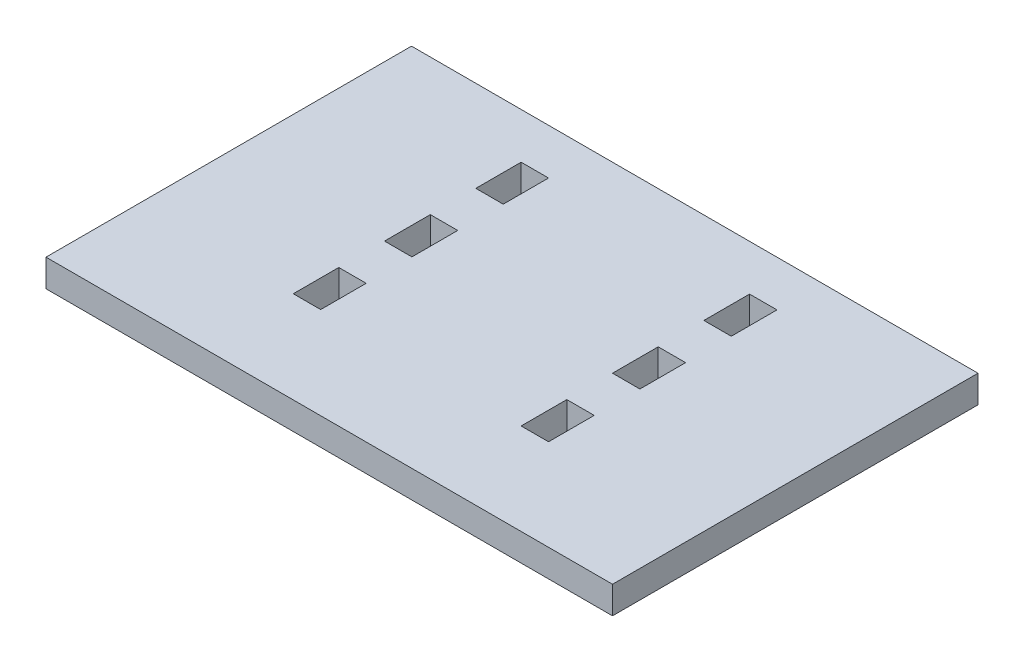
ISO-10303-21;
HEADER;
FILE_DESCRIPTION(('STEP AP214'),'2;1');
FILE_NAME('part.step','',(''),(''),'','','');
FILE_SCHEMA(('AUTOMOTIVE_DESIGN { 1 0 10303 214 1 1 1 1 }'));
ENDSEC;
DATA;
#1=APPLICATION_CONTEXT('core data for automotive mechanical design processes');
#2=APPLICATION_PROTOCOL_DEFINITION('international standard','automotive_design',2000,#1);
#3=PRODUCT_CONTEXT('',#1,'mechanical');
#4=PRODUCT('Part','Part','',(#3));
#5=PRODUCT_RELATED_PRODUCT_CATEGORY('part','',(#4));
#6=PRODUCT_DEFINITION_FORMATION('','',#4);
#7=PRODUCT_DEFINITION_CONTEXT('part definition',#1,'design');
#8=PRODUCT_DEFINITION('design','',#6,#7);
#9=PRODUCT_DEFINITION_SHAPE('','',#8);
#10=(LENGTH_UNIT() NAMED_UNIT(*) SI_UNIT(.MILLI.,.METRE.));
#11=(NAMED_UNIT(*) PLANE_ANGLE_UNIT() SI_UNIT($,.RADIAN.));
#12=(NAMED_UNIT(*) SI_UNIT($,.STERADIAN.) SOLID_ANGLE_UNIT());
#13=UNCERTAINTY_MEASURE_WITH_UNIT(LENGTH_MEASURE(1.E-05),#10,'distance_accuracy_value','');
#14=(GEOMETRIC_REPRESENTATION_CONTEXT(3) GLOBAL_UNCERTAINTY_ASSIGNED_CONTEXT((#13)) GLOBAL_UNIT_ASSIGNED_CONTEXT((#10,
#11,#12)) REPRESENTATION_CONTEXT('',''));
#15=CARTESIAN_POINT('',(0.,0.,0.));
#16=DIRECTION('',(0.,0.,1.));
#17=DIRECTION('',(1.,0.,0.));
#18=AXIS2_PLACEMENT_3D('',#15,#16,#17);
#19=CARTESIAN_POINT('',(0.,3.,0.));
#20=DIRECTION('',(0.,0.,-1.));
#21=DIRECTION('',(-1.,0.,0.));
#22=AXIS2_PLACEMENT_3D('',#19,#20,#21);
#23=PLANE('',#22);
#24=DIRECTION('',(1.,0.,0.));
#25=VECTOR('',#24,1.);
#26=CARTESIAN_POINT('',(0.,0.,0.));
#27=LINE('',#26,#25);
#28=CARTESIAN_POINT('',(-20.,0.,0.));
#29=VERTEX_POINT('',#28);
#30=CARTESIAN_POINT('',(42.,0.,0.));
#31=VERTEX_POINT('',#30);
#32=EDGE_CURVE('E342',#29,#31,#27,.T.);
#33=ORIENTED_EDGE('',*,*,#32,.T.);
#34=DIRECTION('',(0.,-1.,0.));
#35=VECTOR('',#34,1.);
#36=CARTESIAN_POINT('',(42.,3.,0.));
#37=LINE('',#36,#35);
#38=CARTESIAN_POINT('',(42.,3.,0.));
#39=VERTEX_POINT('',#38);
#40=EDGE_CURVE('E11',#39,#31,#37,.T.);
#41=ORIENTED_EDGE('',*,*,#40,.F.);
#42=DIRECTION('',(1.,0.,0.));
#43=VECTOR('',#42,1.);
#44=CARTESIAN_POINT('',(0.,3.,0.));
#45=LINE('',#44,#43);
#46=CARTESIAN_POINT('',(-20.,3.,0.));
#47=VERTEX_POINT('',#46);
#48=EDGE_CURVE('E248',#47,#39,#45,.T.);
#49=ORIENTED_EDGE('',*,*,#48,.F.);
#50=DIRECTION('',(0.,-1.,0.));
#51=VECTOR('',#50,1.);
#52=CARTESIAN_POINT('',(-20.,3.,0.));
#53=LINE('',#52,#51);
#54=EDGE_CURVE('E354',#47,#29,#53,.T.);
#55=ORIENTED_EDGE('',*,*,#54,.T.);
#56=EDGE_LOOP('',(#33,#41,#49,#55));
#57=FACE_BOUND('',#56,.T.);
#58=ADVANCED_FACE('F41',(#57),#23,.F.);
#59=CARTESIAN_POINT('',(42.,3.,0.));
#60=DIRECTION('',(1.,0.,0.));
#61=DIRECTION('',(0.,0.,-1.));
#62=AXIS2_PLACEMENT_3D('',#59,#60,#61);
#63=PLANE('',#62);
#64=DIRECTION('',(0.,0.,1.));
#65=VECTOR('',#64,1.);
#66=CARTESIAN_POINT('',(42.,0.,0.));
#67=LINE('',#66,#65);
#68=CARTESIAN_POINT('',(42.,0.,-40.));
#69=VERTEX_POINT('',#68);
#70=EDGE_CURVE('E238',#69,#31,#67,.T.);
#71=ORIENTED_EDGE('',*,*,#70,.F.);
#72=DIRECTION('',(0.,-1.,0.));
#73=VECTOR('',#72,1.);
#74=CARTESIAN_POINT('',(42.,3.,-40.));
#75=LINE('',#74,#73);
#76=CARTESIAN_POINT('',(42.,3.,-40.));
#77=VERTEX_POINT('',#76);
#78=EDGE_CURVE('E52',#77,#69,#75,.T.);
#79=ORIENTED_EDGE('',*,*,#78,.F.);
#80=DIRECTION('',(0.,0.,1.));
#81=VECTOR('',#80,1.);
#82=CARTESIAN_POINT('',(42.,3.,0.));
#83=LINE('',#82,#81);
#84=EDGE_CURVE('E236',#77,#39,#83,.T.);
#85=ORIENTED_EDGE('',*,*,#84,.T.);
#86=ORIENTED_EDGE('',*,*,#40,.T.);
#87=EDGE_LOOP('',(#71,#79,#85,#86));
#88=FACE_BOUND('',#87,.T.);
#89=ADVANCED_FACE('F235',(#88),#63,.T.);
#90=CARTESIAN_POINT('',(0.,3.,-40.));
#91=DIRECTION('',(0.,0.,-1.));
#92=DIRECTION('',(-1.,0.,0.));
#93=AXIS2_PLACEMENT_3D('',#90,#91,#92);
#94=PLANE('',#93);
#95=DIRECTION('',(1.,0.,0.));
#96=VECTOR('',#95,1.);
#97=CARTESIAN_POINT('',(0.,0.,-40.));
#98=LINE('',#97,#96);
#99=CARTESIAN_POINT('',(-20.,0.,-40.));
#100=VERTEX_POINT('',#99);
#101=EDGE_CURVE('E348',#100,#69,#98,.T.);
#102=ORIENTED_EDGE('',*,*,#101,.F.);
#103=DIRECTION('',(0.,-1.,0.));
#104=VECTOR('',#103,1.);
#105=CARTESIAN_POINT('',(-20.,3.,-40.));
#106=LINE('',#105,#104);
#107=CARTESIAN_POINT('',(-20.,3.,-40.));
#108=VERTEX_POINT('',#107);
#109=EDGE_CURVE('E148',#108,#100,#106,.T.);
#110=ORIENTED_EDGE('',*,*,#109,.F.);
#111=DIRECTION('',(1.,0.,0.));
#112=VECTOR('',#111,1.);
#113=CARTESIAN_POINT('',(0.,3.,-40.));
#114=LINE('',#113,#112);
#115=EDGE_CURVE('E246',#108,#77,#114,.T.);
#116=ORIENTED_EDGE('',*,*,#115,.T.);
#117=ORIENTED_EDGE('',*,*,#78,.T.);
#118=EDGE_LOOP('',(#102,#110,#116,#117));
#119=FACE_BOUND('',#118,.T.);
#120=ADVANCED_FACE('F252',(#119),#94,.T.);
#121=CARTESIAN_POINT('',(0.,3.,0.));
#122=DIRECTION('',(-1.,0.,0.));
#123=DIRECTION('',(0.,0.,1.));
#124=AXIS2_PLACEMENT_3D('',#121,#122,#123);
#125=PLANE('',#124);
#126=DIRECTION('',(0.,0.,-1.));
#127=VECTOR('',#126,1.);
#128=CARTESIAN_POINT('',(0.,0.,0.));
#129=LINE('',#128,#127);
#130=CARTESIAN_POINT('',(0.,0.,-30.0396951821505));
#131=VERTEX_POINT('',#130);
#132=CARTESIAN_POINT('',(0.,0.,-35.));
#133=VERTEX_POINT('',#132);
#134=EDGE_CURVE('E305',#131,#133,#129,.T.);
#135=ORIENTED_EDGE('',*,*,#134,.F.);
#136=DIRECTION('',(0.,-1.,0.));
#137=VECTOR('',#136,1.);
#138=CARTESIAN_POINT('',(0.,3.,-30.0396951821505));
#139=LINE('',#138,#137);
#140=CARTESIAN_POINT('',(0.,3.,-30.0396951821505));
#141=VERTEX_POINT('',#140);
#142=EDGE_CURVE('E357',#141,#131,#139,.T.);
#143=ORIENTED_EDGE('',*,*,#142,.F.);
#144=DIRECTION('',(0.,0.,-1.));
#145=VECTOR('',#144,1.);
#146=CARTESIAN_POINT('',(0.,3.,0.));
#147=LINE('',#146,#145);
#148=CARTESIAN_POINT('',(0.,3.,-35.));
#149=VERTEX_POINT('',#148);
#150=EDGE_CURVE('E491',#141,#149,#147,.T.);
#151=ORIENTED_EDGE('',*,*,#150,.T.);
#152=DIRECTION('',(0.,-1.,0.));
#153=VECTOR('',#152,1.);
#154=CARTESIAN_POINT('',(0.,3.,-35.));
#155=LINE('',#154,#153);
#156=EDGE_CURVE('E360',#149,#133,#155,.T.);
#157=ORIENTED_EDGE('',*,*,#156,.T.);
#158=EDGE_LOOP('',(#135,#143,#151,#157));
#159=FACE_BOUND('',#158,.T.);
#160=ADVANCED_FACE('F588',(#159),#125,.T.);
#161=CARTESIAN_POINT('',(0.,3.,-30.0396951821505));
#162=DIRECTION('',(0.,0.,1.));
#163=DIRECTION('',(1.,0.,0.));
#164=AXIS2_PLACEMENT_3D('',#161,#162,#163);
#165=PLANE('',#164);
#166=DIRECTION('',(-1.,0.,0.));
#167=VECTOR('',#166,1.);
#168=CARTESIAN_POINT('',(0.,0.,-30.0396951821505));
#169=LINE('',#168,#167);
#170=CARTESIAN_POINT('',(-3.,0.,-30.0396951821505));
#171=VERTEX_POINT('',#170);
#172=EDGE_CURVE('E330',#131,#171,#169,.T.);
#173=ORIENTED_EDGE('',*,*,#172,.T.);
#174=DIRECTION('',(0.,-1.,0.));
#175=VECTOR('',#174,1.);
#176=CARTESIAN_POINT('',(-3.,3.,-30.0396951821505));
#177=LINE('',#176,#175);
#178=CARTESIAN_POINT('',(-3.,3.,-30.0396951821505));
#179=VERTEX_POINT('',#178);
#180=EDGE_CURVE('E367',#179,#171,#177,.T.);
#181=ORIENTED_EDGE('',*,*,#180,.F.);
#182=DIRECTION('',(-1.,0.,0.));
#183=VECTOR('',#182,1.);
#184=CARTESIAN_POINT('',(0.,3.,-30.0396951821505));
#185=LINE('',#184,#183);
#186=EDGE_CURVE('E514',#141,#179,#185,.T.);
#187=ORIENTED_EDGE('',*,*,#186,.F.);
#188=ORIENTED_EDGE('',*,*,#142,.T.);
#189=EDGE_LOOP('',(#173,#181,#187,#188));
#190=FACE_BOUND('',#189,.T.);
#191=ADVANCED_FACE('F592',(#190),#165,.F.);
#192=CARTESIAN_POINT('',(-3.,3.,0.));
#193=DIRECTION('',(1.,0.,0.));
#194=DIRECTION('',(0.,0.,-1.));
#195=AXIS2_PLACEMENT_3D('',#192,#193,#194);
#196=PLANE('',#195);
#197=DIRECTION('',(0.,0.,1.));
#198=VECTOR('',#197,1.);
#199=CARTESIAN_POINT('',(-3.,0.,0.));
#200=LINE('',#199,#198);
#201=CARTESIAN_POINT('',(-3.,0.,-35.));
#202=VERTEX_POINT('',#201);
#203=EDGE_CURVE('E334',#202,#171,#200,.T.);
#204=ORIENTED_EDGE('',*,*,#203,.F.);
#205=DIRECTION('',(0.,-1.,0.));
#206=VECTOR('',#205,1.);
#207=CARTESIAN_POINT('',(-3.,3.,-35.));
#208=LINE('',#207,#206);
#209=CARTESIAN_POINT('',(-3.,3.,-35.));
#210=VERTEX_POINT('',#209);
#211=EDGE_CURVE('E363',#210,#202,#208,.T.);
#212=ORIENTED_EDGE('',*,*,#211,.F.);
#213=DIRECTION('',(0.,0.,1.));
#214=VECTOR('',#213,1.);
#215=CARTESIAN_POINT('',(-3.,3.,0.));
#216=LINE('',#215,#214);
#217=EDGE_CURVE('E517',#210,#179,#216,.T.);
#218=ORIENTED_EDGE('',*,*,#217,.T.);
#219=ORIENTED_EDGE('',*,*,#180,.T.);
#220=EDGE_LOOP('',(#204,#212,#218,#219));
#221=FACE_BOUND('',#220,.T.);
#222=ADVANCED_FACE('F595',(#221),#196,.T.);
#223=CARTESIAN_POINT('',(0.,0.,-20.0456534086488));
#224=VERTEX_POINT('',#223);
#225=CARTESIAN_POINT('',(0.,0.,-25.0601748364164));
#226=VERTEX_POINT('',#225);
#227=EDGE_CURVE('E306',#224,#226,#129,.T.);
#228=ORIENTED_EDGE('',*,*,#227,.F.);
#229=DIRECTION('',(0.,-1.,0.));
#230=VECTOR('',#229,1.);
#231=CARTESIAN_POINT('',(0.,3.,-20.0456534086488));
#232=LINE('',#231,#230);
#233=CARTESIAN_POINT('',(0.,3.,-20.0456534086488));
#234=VERTEX_POINT('',#233);
#235=EDGE_CURVE('E364',#234,#224,#232,.T.);
#236=ORIENTED_EDGE('',*,*,#235,.F.);
#237=CARTESIAN_POINT('',(0.,3.,-25.0601748364164));
#238=VERTEX_POINT('',#237);
#239=EDGE_CURVE('E492',#234,#238,#147,.T.);
#240=ORIENTED_EDGE('',*,*,#239,.T.);
#241=DIRECTION('',(0.,-1.,0.));
#242=VECTOR('',#241,1.);
#243=CARTESIAN_POINT('',(0.,3.,-25.0601748364164));
#244=LINE('',#243,#242);
#245=EDGE_CURVE('E372',#238,#226,#244,.T.);
#246=ORIENTED_EDGE('',*,*,#245,.T.);
#247=EDGE_LOOP('',(#228,#236,#240,#246));
#248=FACE_BOUND('',#247,.T.);
#249=ADVANCED_FACE('F619',(#248),#125,.T.);
#250=CARTESIAN_POINT('',(0.,3.,-20.0456534086488));
#251=DIRECTION('',(0.,0.,1.));
#252=DIRECTION('',(1.,0.,0.));
#253=AXIS2_PLACEMENT_3D('',#250,#251,#252);
#254=PLANE('',#253);
#255=DIRECTION('',(-1.,0.,0.));
#256=VECTOR('',#255,1.);
#257=CARTESIAN_POINT('',(0.,0.,-20.0456534086488));
#258=LINE('',#257,#256);
#259=CARTESIAN_POINT('',(-3.,0.,-20.0456534086488));
#260=VERTEX_POINT('',#259);
#261=EDGE_CURVE('E318',#224,#260,#258,.T.);
#262=ORIENTED_EDGE('',*,*,#261,.T.);
#263=DIRECTION('',(0.,-1.,0.));
#264=VECTOR('',#263,1.);
#265=CARTESIAN_POINT('',(-3.,3.,-20.0456534086488));
#266=LINE('',#265,#264);
#267=CARTESIAN_POINT('',(-3.,3.,-20.0456534086488));
#268=VERTEX_POINT('',#267);
#269=EDGE_CURVE('E379',#268,#260,#266,.T.);
#270=ORIENTED_EDGE('',*,*,#269,.F.);
#271=DIRECTION('',(-1.,0.,0.));
#272=VECTOR('',#271,1.);
#273=CARTESIAN_POINT('',(0.,3.,-20.0456534086488));
#274=LINE('',#273,#272);
#275=EDGE_CURVE('E503',#234,#268,#274,.T.);
#276=ORIENTED_EDGE('',*,*,#275,.F.);
#277=ORIENTED_EDGE('',*,*,#235,.T.);
#278=EDGE_LOOP('',(#262,#270,#276,#277));
#279=FACE_BOUND('',#278,.T.);
#280=ADVANCED_FACE('F618',(#279),#254,.F.);
#281=CARTESIAN_POINT('',(-3.,3.,0.));
#282=DIRECTION('',(1.,0.,0.));
#283=DIRECTION('',(0.,0.,-1.));
#284=AXIS2_PLACEMENT_3D('',#281,#282,#283);
#285=PLANE('',#284);
#286=DIRECTION('',(0.,0.,1.));
#287=VECTOR('',#286,1.);
#288=CARTESIAN_POINT('',(-3.,0.,0.));
#289=LINE('',#288,#287);
#290=CARTESIAN_POINT('',(-3.,0.,-25.0601748364164));
#291=VERTEX_POINT('',#290);
#292=EDGE_CURVE('E322',#291,#260,#289,.T.);
#293=ORIENTED_EDGE('',*,*,#292,.F.);
#294=DIRECTION('',(0.,-1.,0.));
#295=VECTOR('',#294,1.);
#296=CARTESIAN_POINT('',(-3.,3.,-25.0601748364164));
#297=LINE('',#296,#295);
#298=CARTESIAN_POINT('',(-3.,3.,-25.0601748364164));
#299=VERTEX_POINT('',#298);
#300=EDGE_CURVE('E375',#299,#291,#297,.T.);
#301=ORIENTED_EDGE('',*,*,#300,.F.);
#302=DIRECTION('',(0.,0.,1.));
#303=VECTOR('',#302,1.);
#304=CARTESIAN_POINT('',(-3.,3.,0.));
#305=LINE('',#304,#303);
#306=EDGE_CURVE('E506',#299,#268,#305,.T.);
#307=ORIENTED_EDGE('',*,*,#306,.T.);
#308=ORIENTED_EDGE('',*,*,#269,.T.);
#309=EDGE_LOOP('',(#293,#301,#307,#308));
#310=FACE_BOUND('',#309,.T.);
#311=ADVANCED_FACE('F614',(#310),#285,.T.);
#312=CARTESIAN_POINT('',(0.,0.,-10.0627705245664));
#313=VERTEX_POINT('',#312);
#314=CARTESIAN_POINT('',(0.,0.,-15.0419221686592));
#315=VERTEX_POINT('',#314);
#316=EDGE_CURVE('E300',#313,#315,#129,.T.);
#317=ORIENTED_EDGE('',*,*,#316,.F.);
#318=DIRECTION('',(0.,-1.,0.));
#319=VECTOR('',#318,1.);
#320=CARTESIAN_POINT('',(0.,3.,-10.0627705245664));
#321=LINE('',#320,#319);
#322=CARTESIAN_POINT('',(0.,3.,-10.0627705245664));
#323=VERTEX_POINT('',#322);
#324=EDGE_CURVE('E376',#323,#313,#321,.T.);
#325=ORIENTED_EDGE('',*,*,#324,.F.);
#326=CARTESIAN_POINT('',(0.,3.,-15.0419221686592));
#327=VERTEX_POINT('',#326);
#328=EDGE_CURVE('E486',#323,#327,#147,.T.);
#329=ORIENTED_EDGE('',*,*,#328,.T.);
#330=DIRECTION('',(0.,-1.,0.));
#331=VECTOR('',#330,1.);
#332=CARTESIAN_POINT('',(0.,3.,-15.0419221686592));
#333=LINE('',#332,#331);
#334=EDGE_CURVE('E384',#327,#315,#333,.T.);
#335=ORIENTED_EDGE('',*,*,#334,.T.);
#336=EDGE_LOOP('',(#317,#325,#329,#335));
#337=FACE_BOUND('',#336,.T.);
#338=ADVANCED_FACE('F622',(#337),#125,.T.);
#339=CARTESIAN_POINT('',(0.,3.,-10.0627705245664));
#340=DIRECTION('',(0.,0.,1.));
#341=DIRECTION('',(1.,0.,0.));
#342=AXIS2_PLACEMENT_3D('',#339,#340,#341);
#343=PLANE('',#342);
#344=DIRECTION('',(-1.,0.,0.));
#345=VECTOR('',#344,1.);
#346=CARTESIAN_POINT('',(0.,0.,-10.0627705245664));
#347=LINE('',#346,#345);
#348=CARTESIAN_POINT('',(-3.,0.,-10.0627705245664));
#349=VERTEX_POINT('',#348);
#350=EDGE_CURVE('E304',#313,#349,#347,.T.);
#351=ORIENTED_EDGE('',*,*,#350,.T.);
#352=DIRECTION('',(0.,-1.,0.));
#353=VECTOR('',#352,1.);
#354=CARTESIAN_POINT('',(-3.,3.,-10.0627705245664));
#355=LINE('',#354,#353);
#356=CARTESIAN_POINT('',(-3.,3.,-10.0627705245664));
#357=VERTEX_POINT('',#356);
#358=EDGE_CURVE('E391',#357,#349,#355,.T.);
#359=ORIENTED_EDGE('',*,*,#358,.F.);
#360=DIRECTION('',(-1.,0.,0.));
#361=VECTOR('',#360,1.);
#362=CARTESIAN_POINT('',(0.,3.,-10.0627705245664));
#363=LINE('',#362,#361);
#364=EDGE_CURVE('E490',#323,#357,#363,.T.);
#365=ORIENTED_EDGE('',*,*,#364,.F.);
#366=ORIENTED_EDGE('',*,*,#324,.T.);
#367=EDGE_LOOP('',(#351,#359,#365,#366));
#368=FACE_BOUND('',#367,.T.);
#369=ADVANCED_FACE('F633',(#368),#343,.F.);
#370=CARTESIAN_POINT('',(-3.,3.,0.));
#371=DIRECTION('',(1.,0.,0.));
#372=DIRECTION('',(0.,0.,-1.));
#373=AXIS2_PLACEMENT_3D('',#370,#371,#372);
#374=PLANE('',#373);
#375=DIRECTION('',(0.,0.,1.));
#376=VECTOR('',#375,1.);
#377=CARTESIAN_POINT('',(-3.,0.,0.));
#378=LINE('',#377,#376);
#379=CARTESIAN_POINT('',(-3.,0.,-15.0419221686592));
#380=VERTEX_POINT('',#379);
#381=EDGE_CURVE('E310',#380,#349,#378,.T.);
#382=ORIENTED_EDGE('',*,*,#381,.F.);
#383=DIRECTION('',(0.,-1.,0.));
#384=VECTOR('',#383,1.);
#385=CARTESIAN_POINT('',(-3.,3.,-15.0419221686592));
#386=LINE('',#385,#384);
#387=CARTESIAN_POINT('',(-3.,3.,-15.0419221686592));
#388=VERTEX_POINT('',#387);
#389=EDGE_CURVE('E387',#388,#380,#386,.T.);
#390=ORIENTED_EDGE('',*,*,#389,.F.);
#391=DIRECTION('',(0.,0.,1.));
#392=VECTOR('',#391,1.);
#393=CARTESIAN_POINT('',(-3.,3.,0.));
#394=LINE('',#393,#392);
#395=EDGE_CURVE('E495',#388,#357,#394,.T.);
#396=ORIENTED_EDGE('',*,*,#395,.T.);
#397=ORIENTED_EDGE('',*,*,#358,.T.);
#398=EDGE_LOOP('',(#382,#390,#396,#397));
#399=FACE_BOUND('',#398,.T.);
#400=ADVANCED_FACE('F692',(#399),#374,.T.);
#401=CARTESIAN_POINT('',(0.,3.,-30.));
#402=DIRECTION('',(0.,0.,-1.));
#403=DIRECTION('',(-1.,0.,0.));
#404=AXIS2_PLACEMENT_3D('',#401,#402,#403);
#405=PLANE('',#404);
#406=DIRECTION('',(1.,0.,0.));
#407=VECTOR('',#406,1.);
#408=CARTESIAN_POINT('',(0.,0.,-30.));
#409=LINE('',#408,#407);
#410=CARTESIAN_POINT('',(22.,0.,-30.));
#411=VERTEX_POINT('',#410);
#412=CARTESIAN_POINT('',(24.9981122641106,0.,-30.));
#413=VERTEX_POINT('',#412);
#414=EDGE_CURVE('E288',#411,#413,#409,.T.);
#415=ORIENTED_EDGE('',*,*,#414,.F.);
#416=DIRECTION('',(0.,-1.,0.));
#417=VECTOR('',#416,1.);
#418=CARTESIAN_POINT('',(22.,3.,-30.));
#419=LINE('',#418,#417);
#420=CARTESIAN_POINT('',(22.,3.,-30.));
#421=VERTEX_POINT('',#420);
#422=EDGE_CURVE('E388',#421,#411,#419,.T.);
#423=ORIENTED_EDGE('',*,*,#422,.F.);
#424=DIRECTION('',(1.,0.,0.));
#425=VECTOR('',#424,1.);
#426=CARTESIAN_POINT('',(0.,3.,-30.));
#427=LINE('',#426,#425);
#428=CARTESIAN_POINT('',(24.9981122641106,3.,-30.));
#429=VERTEX_POINT('',#428);
#430=EDGE_CURVE('E475',#421,#429,#427,.T.);
#431=ORIENTED_EDGE('',*,*,#430,.T.);
#432=DIRECTION('',(0.,-1.,0.));
#433=VECTOR('',#432,1.);
#434=CARTESIAN_POINT('',(24.9981122641106,3.,-30.));
#435=LINE('',#434,#433);
#436=EDGE_CURVE('E396',#429,#413,#435,.T.);
#437=ORIENTED_EDGE('',*,*,#436,.T.);
#438=EDGE_LOOP('',(#415,#423,#431,#437));
#439=FACE_BOUND('',#438,.T.);
#440=ADVANCED_FACE('F563',(#439),#405,.T.);
#441=CARTESIAN_POINT('',(22.,3.,0.));
#442=DIRECTION('',(-1.,0.,0.));
#443=DIRECTION('',(0.,0.,1.));
#444=AXIS2_PLACEMENT_3D('',#441,#442,#443);
#445=PLANE('',#444);
#446=DIRECTION('',(0.,0.,-1.));
#447=VECTOR('',#446,1.);
#448=CARTESIAN_POINT('',(22.,0.,0.));
#449=LINE('',#448,#447);
#450=CARTESIAN_POINT('',(22.,0.,-35.));
#451=VERTEX_POINT('',#450);
#452=EDGE_CURVE('E268',#411,#451,#449,.T.);
#453=ORIENTED_EDGE('',*,*,#452,.T.);
#454=DIRECTION('',(0.,-1.,0.));
#455=VECTOR('',#454,1.);
#456=CARTESIAN_POINT('',(22.,3.,-35.));
#457=LINE('',#456,#455);
#458=CARTESIAN_POINT('',(22.,3.,-35.));
#459=VERTEX_POINT('',#458);
#460=EDGE_CURVE('E404',#459,#451,#457,.T.);
#461=ORIENTED_EDGE('',*,*,#460,.F.);
#462=DIRECTION('',(0.,0.,-1.));
#463=VECTOR('',#462,1.);
#464=CARTESIAN_POINT('',(22.,3.,0.));
#465=LINE('',#464,#463);
#466=EDGE_CURVE('E461',#421,#459,#465,.T.);
#467=ORIENTED_EDGE('',*,*,#466,.F.);
#468=ORIENTED_EDGE('',*,*,#422,.T.);
#469=EDGE_LOOP('',(#453,#461,#467,#468));
#470=FACE_BOUND('',#469,.T.);
#471=ADVANCED_FACE('F558',(#470),#445,.F.);
#472=CARTESIAN_POINT('',(0.,3.,-35.));
#473=DIRECTION('',(0.,0.,-1.));
#474=DIRECTION('',(-1.,0.,0.));
#475=AXIS2_PLACEMENT_3D('',#472,#473,#474);
#476=PLANE('',#475);
#477=DIRECTION('',(1.,0.,0.));
#478=VECTOR('',#477,1.);
#479=CARTESIAN_POINT('',(0.,0.,-35.));
#480=LINE('',#479,#478);
#481=CARTESIAN_POINT('',(24.9981122641106,0.,-35.));
#482=VERTEX_POINT('',#481);
#483=EDGE_CURVE('E292',#451,#482,#480,.T.);
#484=ORIENTED_EDGE('',*,*,#483,.T.);
#485=DIRECTION('',(0.,-1.,0.));
#486=VECTOR('',#485,1.);
#487=CARTESIAN_POINT('',(24.9981122641106,3.,-35.));
#488=LINE('',#487,#486);
#489=CARTESIAN_POINT('',(24.9981122641106,3.,-35.));
#490=VERTEX_POINT('',#489);
#491=EDGE_CURVE('E399',#490,#482,#488,.T.);
#492=ORIENTED_EDGE('',*,*,#491,.F.);
#493=DIRECTION('',(1.,0.,0.));
#494=VECTOR('',#493,1.);
#495=CARTESIAN_POINT('',(0.,3.,-35.));
#496=LINE('',#495,#494);
#497=EDGE_CURVE('E479',#459,#490,#496,.T.);
#498=ORIENTED_EDGE('',*,*,#497,.F.);
#499=ORIENTED_EDGE('',*,*,#460,.T.);
#500=EDGE_LOOP('',(#484,#492,#498,#499));
#501=FACE_BOUND('',#500,.T.);
#502=ADVANCED_FACE('F570',(#501),#476,.F.);
#503=CARTESIAN_POINT('',(0.,3.,-20.));
#504=DIRECTION('',(0.,0.,-1.));
#505=DIRECTION('',(-1.,0.,0.));
#506=AXIS2_PLACEMENT_3D('',#503,#504,#505);
#507=PLANE('',#506);
#508=DIRECTION('',(1.,0.,0.));
#509=VECTOR('',#508,1.);
#510=CARTESIAN_POINT('',(0.,0.,-20.));
#511=LINE('',#510,#509);
#512=CARTESIAN_POINT('',(22.,0.,-20.));
#513=VERTEX_POINT('',#512);
#514=CARTESIAN_POINT('',(24.9981122641106,0.,-20.));
#515=VERTEX_POINT('',#514);
#516=EDGE_CURVE('E276',#513,#515,#511,.T.);
#517=ORIENTED_EDGE('',*,*,#516,.F.);
#518=DIRECTION('',(0.,-1.,0.));
#519=VECTOR('',#518,1.);
#520=CARTESIAN_POINT('',(22.,3.,-20.));
#521=LINE('',#520,#519);
#522=CARTESIAN_POINT('',(22.,3.,-20.));
#523=VERTEX_POINT('',#522);
#524=EDGE_CURVE('E400',#523,#513,#521,.T.);
#525=ORIENTED_EDGE('',*,*,#524,.F.);
#526=DIRECTION('',(1.,0.,0.));
#527=VECTOR('',#526,1.);
#528=CARTESIAN_POINT('',(0.,3.,-20.));
#529=LINE('',#528,#527);
#530=CARTESIAN_POINT('',(24.9981122641106,3.,-20.));
#531=VERTEX_POINT('',#530);
#532=EDGE_CURVE('E458',#523,#531,#529,.T.);
#533=ORIENTED_EDGE('',*,*,#532,.T.);
#534=DIRECTION('',(0.,-1.,0.));
#535=VECTOR('',#534,1.);
#536=CARTESIAN_POINT('',(24.9981122641106,3.,-20.));
#537=LINE('',#536,#535);
#538=EDGE_CURVE('E410',#531,#515,#537,.T.);
#539=ORIENTED_EDGE('',*,*,#538,.T.);
#540=EDGE_LOOP('',(#517,#525,#533,#539));
#541=FACE_BOUND('',#540,.T.);
#542=ADVANCED_FACE('F550',(#541),#507,.T.);
#543=CARTESIAN_POINT('',(22.,0.,-25.));
#544=VERTEX_POINT('',#543);
#545=EDGE_CURVE('E269',#513,#544,#449,.T.);
#546=ORIENTED_EDGE('',*,*,#545,.T.);
#547=DIRECTION('',(0.,-1.,0.));
#548=VECTOR('',#547,1.);
#549=CARTESIAN_POINT('',(22.,3.,-25.));
#550=LINE('',#549,#548);
#551=CARTESIAN_POINT('',(22.,3.,-25.));
#552=VERTEX_POINT('',#551);
#553=EDGE_CURVE('E417',#552,#544,#550,.T.);
#554=ORIENTED_EDGE('',*,*,#553,.F.);
#555=EDGE_CURVE('E462',#523,#552,#465,.T.);
#556=ORIENTED_EDGE('',*,*,#555,.F.);
#557=ORIENTED_EDGE('',*,*,#524,.T.);
#558=EDGE_LOOP('',(#546,#554,#556,#557));
#559=FACE_BOUND('',#558,.T.);
#560=ADVANCED_FACE('F541',(#559),#445,.F.);
#561=CARTESIAN_POINT('',(0.,3.,-25.));
#562=DIRECTION('',(0.,0.,-1.));
#563=DIRECTION('',(-1.,0.,0.));
#564=AXIS2_PLACEMENT_3D('',#561,#562,#563);
#565=PLANE('',#564);
#566=DIRECTION('',(1.,0.,0.));
#567=VECTOR('',#566,1.);
#568=CARTESIAN_POINT('',(0.,0.,-25.));
#569=LINE('',#568,#567);
#570=CARTESIAN_POINT('',(24.9981122641106,0.,-25.));
#571=VERTEX_POINT('',#570);
#572=EDGE_CURVE('E280',#544,#571,#569,.T.);
#573=ORIENTED_EDGE('',*,*,#572,.T.);
#574=DIRECTION('',(0.,-1.,0.));
#575=VECTOR('',#574,1.);
#576=CARTESIAN_POINT('',(24.9981122641106,3.,-25.));
#577=LINE('',#576,#575);
#578=CARTESIAN_POINT('',(24.9981122641106,3.,-25.));
#579=VERTEX_POINT('',#578);
#580=EDGE_CURVE('E413',#579,#571,#577,.T.);
#581=ORIENTED_EDGE('',*,*,#580,.F.);
#582=DIRECTION('',(1.,0.,0.));
#583=VECTOR('',#582,1.);
#584=CARTESIAN_POINT('',(0.,3.,-25.));
#585=LINE('',#584,#583);
#586=EDGE_CURVE('E468',#552,#579,#585,.T.);
#587=ORIENTED_EDGE('',*,*,#586,.F.);
#588=ORIENTED_EDGE('',*,*,#553,.T.);
#589=EDGE_LOOP('',(#573,#581,#587,#588));
#590=FACE_BOUND('',#589,.T.);
#591=ADVANCED_FACE('F544',(#590),#565,.F.);
#592=CARTESIAN_POINT('',(0.,3.,-10.));
#593=DIRECTION('',(0.,0.,-1.));
#594=DIRECTION('',(-1.,0.,0.));
#595=AXIS2_PLACEMENT_3D('',#592,#593,#594);
#596=PLANE('',#595);
#597=DIRECTION('',(1.,0.,0.));
#598=VECTOR('',#597,1.);
#599=CARTESIAN_POINT('',(0.,0.,-10.));
#600=LINE('',#599,#598);
#601=CARTESIAN_POINT('',(22.,0.,-10.));
#602=VERTEX_POINT('',#601);
#603=CARTESIAN_POINT('',(24.9981122641106,0.,-10.));
#604=VERTEX_POINT('',#603);
#605=EDGE_CURVE('E260',#602,#604,#600,.T.);
#606=ORIENTED_EDGE('',*,*,#605,.F.);
#607=DIRECTION('',(0.,-1.,0.));
#608=VECTOR('',#607,1.);
#609=CARTESIAN_POINT('',(22.,3.,-10.));
#610=LINE('',#609,#608);
#611=CARTESIAN_POINT('',(22.,3.,-10.));
#612=VERTEX_POINT('',#611);
#613=EDGE_CURVE('E45',#612,#602,#610,.T.);
#614=ORIENTED_EDGE('',*,*,#613,.F.);
#615=DIRECTION('',(1.,0.,0.));
#616=VECTOR('',#615,1.);
#617=CARTESIAN_POINT('',(0.,3.,-10.));
#618=LINE('',#617,#616);
#619=CARTESIAN_POINT('',(24.9981122641106,3.,-10.));
#620=VERTEX_POINT('',#619);
#621=EDGE_CURVE('E353',#612,#620,#618,.T.);
#622=ORIENTED_EDGE('',*,*,#621,.T.);
#623=DIRECTION('',(0.,-1.,0.));
#624=VECTOR('',#623,1.);
#625=CARTESIAN_POINT('',(24.9981122641106,3.,-10.));
#626=LINE('',#625,#624);
#627=EDGE_CURVE('E256',#620,#604,#626,.T.);
#628=ORIENTED_EDGE('',*,*,#627,.T.);
#629=EDGE_LOOP('',(#606,#614,#622,#628));
#630=FACE_BOUND('',#629,.T.);
#631=ADVANCED_FACE('F43',(#630),#596,.T.);
#632=CARTESIAN_POINT('',(22.,0.,-15.));
#633=VERTEX_POINT('',#632);
#634=EDGE_CURVE('E264',#602,#633,#449,.T.);
#635=ORIENTED_EDGE('',*,*,#634,.T.);
#636=DIRECTION('',(0.,-1.,0.));
#637=VECTOR('',#636,1.);
#638=CARTESIAN_POINT('',(22.,3.,-15.));
#639=LINE('',#638,#637);
#640=CARTESIAN_POINT('',(22.,3.,-15.));
#641=VERTEX_POINT('',#640);
#642=EDGE_CURVE('E428',#641,#633,#639,.T.);
#643=ORIENTED_EDGE('',*,*,#642,.F.);
#644=EDGE_CURVE('E439',#612,#641,#465,.T.);
#645=ORIENTED_EDGE('',*,*,#644,.F.);
#646=ORIENTED_EDGE('',*,*,#613,.T.);
#647=EDGE_LOOP('',(#635,#643,#645,#646));
#648=FACE_BOUND('',#647,.T.);
#649=ADVANCED_FACE('F438',(#648),#445,.F.);
#650=CARTESIAN_POINT('',(0.,3.,-15.));
#651=DIRECTION('',(0.,0.,-1.));
#652=DIRECTION('',(-1.,0.,0.));
#653=AXIS2_PLACEMENT_3D('',#650,#651,#652);
#654=PLANE('',#653);
#655=DIRECTION('',(1.,0.,0.));
#656=VECTOR('',#655,1.);
#657=CARTESIAN_POINT('',(0.,0.,-15.));
#658=LINE('',#657,#656);
#659=CARTESIAN_POINT('',(24.9981122641106,0.,-15.));
#660=VERTEX_POINT('',#659);
#661=EDGE_CURVE('E267',#633,#660,#658,.T.);
#662=ORIENTED_EDGE('',*,*,#661,.T.);
#663=DIRECTION('',(0.,-1.,0.));
#664=VECTOR('',#663,1.);
#665=CARTESIAN_POINT('',(24.9981122641106,3.,-15.));
#666=LINE('',#665,#664);
#667=CARTESIAN_POINT('',(24.9981122641106,3.,-15.));
#668=VERTEX_POINT('',#667);
#669=EDGE_CURVE('E425',#668,#660,#666,.T.);
#670=ORIENTED_EDGE('',*,*,#669,.F.);
#671=DIRECTION('',(1.,0.,0.));
#672=VECTOR('',#671,1.);
#673=CARTESIAN_POINT('',(0.,3.,-15.));
#674=LINE('',#673,#672);
#675=EDGE_CURVE('E452',#641,#668,#674,.T.);
#676=ORIENTED_EDGE('',*,*,#675,.F.);
#677=ORIENTED_EDGE('',*,*,#642,.T.);
#678=EDGE_LOOP('',(#662,#670,#676,#677));
#679=FACE_BOUND('',#678,.T.);
#680=ADVANCED_FACE('F451',(#679),#654,.F.);
#681=CARTESIAN_POINT('',(0.,3.,-35.));
#682=DIRECTION('',(0.,0.,1.));
#683=DIRECTION('',(1.,0.,0.));
#684=AXIS2_PLACEMENT_3D('',#681,#682,#683);
#685=PLANE('',#684);
#686=DIRECTION('',(-1.,0.,0.));
#687=VECTOR('',#686,1.);
#688=CARTESIAN_POINT('',(0.,0.,-35.));
#689=LINE('',#688,#687);
#690=EDGE_CURVE('E338',#133,#202,#689,.T.);
#691=ORIENTED_EDGE('',*,*,#690,.F.);
#692=ORIENTED_EDGE('',*,*,#156,.F.);
#693=DIRECTION('',(-1.,0.,0.));
#694=VECTOR('',#693,1.);
#695=CARTESIAN_POINT('',(0.,3.,-35.));
#696=LINE('',#695,#694);
#697=EDGE_CURVE('E521',#149,#210,#696,.T.);
#698=ORIENTED_EDGE('',*,*,#697,.T.);
#699=ORIENTED_EDGE('',*,*,#211,.T.);
#700=EDGE_LOOP('',(#691,#692,#698,#699));
#701=FACE_BOUND('',#700,.T.);
#702=ADVANCED_FACE('F598',(#701),#685,.T.);
#703=CARTESIAN_POINT('',(0.,3.,-25.0601748364164));
#704=DIRECTION('',(0.,0.,1.));
#705=DIRECTION('',(1.,0.,0.));
#706=AXIS2_PLACEMENT_3D('',#703,#704,#705);
#707=PLANE('',#706);
#708=DIRECTION('',(-1.,0.,0.));
#709=VECTOR('',#708,1.);
#710=CARTESIAN_POINT('',(0.,0.,-25.0601748364164));
#711=LINE('',#710,#709);
#712=EDGE_CURVE('E326',#226,#291,#711,.T.);
#713=ORIENTED_EDGE('',*,*,#712,.F.);
#714=ORIENTED_EDGE('',*,*,#245,.F.);
#715=DIRECTION('',(-1.,0.,0.));
#716=VECTOR('',#715,1.);
#717=CARTESIAN_POINT('',(0.,3.,-25.0601748364164));
#718=LINE('',#717,#716);
#719=EDGE_CURVE('E510',#238,#299,#718,.T.);
#720=ORIENTED_EDGE('',*,*,#719,.T.);
#721=ORIENTED_EDGE('',*,*,#300,.T.);
#722=EDGE_LOOP('',(#713,#714,#720,#721));
#723=FACE_BOUND('',#722,.T.);
#724=ADVANCED_FACE('F610',(#723),#707,.T.);
#725=CARTESIAN_POINT('',(0.,3.,-15.0419221686592));
#726=DIRECTION('',(0.,0.,1.));
#727=DIRECTION('',(1.,0.,0.));
#728=AXIS2_PLACEMENT_3D('',#725,#726,#727);
#729=PLANE('',#728);
#730=DIRECTION('',(-1.,0.,0.));
#731=VECTOR('',#730,1.);
#732=CARTESIAN_POINT('',(0.,0.,-15.0419221686592));
#733=LINE('',#732,#731);
#734=EDGE_CURVE('E314',#315,#380,#733,.T.);
#735=ORIENTED_EDGE('',*,*,#734,.F.);
#736=ORIENTED_EDGE('',*,*,#334,.F.);
#737=DIRECTION('',(-1.,0.,0.));
#738=VECTOR('',#737,1.);
#739=CARTESIAN_POINT('',(0.,3.,-15.0419221686592));
#740=LINE('',#739,#738);
#741=EDGE_CURVE('E499',#327,#388,#740,.T.);
#742=ORIENTED_EDGE('',*,*,#741,.T.);
#743=ORIENTED_EDGE('',*,*,#389,.T.);
#744=EDGE_LOOP('',(#735,#736,#742,#743));
#745=FACE_BOUND('',#744,.T.);
#746=ADVANCED_FACE('F791',(#745),#729,.T.);
#747=CARTESIAN_POINT('',(24.9981122641106,3.,0.));
#748=DIRECTION('',(1.,0.,0.));
#749=DIRECTION('',(0.,0.,-1.));
#750=AXIS2_PLACEMENT_3D('',#747,#748,#749);
#751=PLANE('',#750);
#752=DIRECTION('',(0.,0.,1.));
#753=VECTOR('',#752,1.);
#754=CARTESIAN_POINT('',(24.9981122641106,0.,0.));
#755=LINE('',#754,#753);
#756=EDGE_CURVE('E296',#482,#413,#755,.T.);
#757=ORIENTED_EDGE('',*,*,#756,.T.);
#758=ORIENTED_EDGE('',*,*,#436,.F.);
#759=DIRECTION('',(0.,0.,1.));
#760=VECTOR('',#759,1.);
#761=CARTESIAN_POINT('',(24.9981122641106,3.,0.));
#762=LINE('',#761,#760);
#763=EDGE_CURVE('E483',#490,#429,#762,.T.);
#764=ORIENTED_EDGE('',*,*,#763,.F.);
#765=ORIENTED_EDGE('',*,*,#491,.T.);
#766=EDGE_LOOP('',(#757,#758,#764,#765));
#767=FACE_BOUND('',#766,.T.);
#768=ADVANCED_FACE('F567',(#767),#751,.F.);
#769=CARTESIAN_POINT('',(24.9981122641106,3.,0.));
#770=DIRECTION('',(1.,0.,0.));
#771=DIRECTION('',(0.,0.,-1.));
#772=AXIS2_PLACEMENT_3D('',#769,#770,#771);
#773=PLANE('',#772);
#774=DIRECTION('',(0.,0.,1.));
#775=VECTOR('',#774,1.);
#776=CARTESIAN_POINT('',(24.9981122641106,0.,0.));
#777=LINE('',#776,#775);
#778=EDGE_CURVE('E284',#571,#515,#777,.T.);
#779=ORIENTED_EDGE('',*,*,#778,.T.);
#780=ORIENTED_EDGE('',*,*,#538,.F.);
#781=DIRECTION('',(0.,0.,1.));
#782=VECTOR('',#781,1.);
#783=CARTESIAN_POINT('',(24.9981122641106,3.,0.));
#784=LINE('',#783,#782);
#785=EDGE_CURVE('E472',#579,#531,#784,.T.);
#786=ORIENTED_EDGE('',*,*,#785,.F.);
#787=ORIENTED_EDGE('',*,*,#580,.T.);
#788=EDGE_LOOP('',(#779,#780,#786,#787));
#789=FACE_BOUND('',#788,.T.);
#790=ADVANCED_FACE('F546',(#789),#773,.F.);
#791=CARTESIAN_POINT('',(24.9981122641106,3.,0.));
#792=DIRECTION('',(1.,0.,0.));
#793=DIRECTION('',(0.,0.,-1.));
#794=AXIS2_PLACEMENT_3D('',#791,#792,#793);
#795=PLANE('',#794);
#796=DIRECTION('',(0.,0.,1.));
#797=VECTOR('',#796,1.);
#798=CARTESIAN_POINT('',(24.9981122641106,0.,0.));
#799=LINE('',#798,#797);
#800=EDGE_CURVE('E272',#660,#604,#799,.T.);
#801=ORIENTED_EDGE('',*,*,#800,.T.);
#802=ORIENTED_EDGE('',*,*,#627,.F.);
#803=DIRECTION('',(0.,0.,1.));
#804=VECTOR('',#803,1.);
#805=CARTESIAN_POINT('',(24.9981122641106,3.,0.));
#806=LINE('',#805,#804);
#807=EDGE_CURVE('E450',#668,#620,#806,.T.);
#808=ORIENTED_EDGE('',*,*,#807,.F.);
#809=ORIENTED_EDGE('',*,*,#669,.T.);
#810=EDGE_LOOP('',(#801,#802,#808,#809));
#811=FACE_BOUND('',#810,.T.);
#812=ADVANCED_FACE('F448',(#811),#795,.F.);
#813=CARTESIAN_POINT('',(-20.,3.,0.));
#814=DIRECTION('',(1.,0.,0.));
#815=DIRECTION('',(0.,0.,-1.));
#816=AXIS2_PLACEMENT_3D('',#813,#814,#815);
#817=PLANE('',#816);
#818=DIRECTION('',(0.,0.,1.));
#819=VECTOR('',#818,1.);
#820=CARTESIAN_POINT('',(-20.,0.,0.));
#821=LINE('',#820,#819);
#822=EDGE_CURVE('E151',#100,#29,#821,.T.);
#823=ORIENTED_EDGE('',*,*,#822,.T.);
#824=ORIENTED_EDGE('',*,*,#54,.F.);
#825=DIRECTION('',(0.,0.,1.));
#826=VECTOR('',#825,1.);
#827=CARTESIAN_POINT('',(-20.,3.,0.));
#828=LINE('',#827,#826);
#829=EDGE_CURVE('E61',#108,#47,#828,.T.);
#830=ORIENTED_EDGE('',*,*,#829,.F.);
#831=ORIENTED_EDGE('',*,*,#109,.T.);
#832=EDGE_LOOP('',(#823,#824,#830,#831));
#833=FACE_BOUND('',#832,.T.);
#834=ADVANCED_FACE('F573',(#833),#817,.F.);
#835=CARTESIAN_POINT('',(0.,3.,0.));
#836=DIRECTION('',(0.,1.,0.));
#837=DIRECTION('',(0.,0.,1.));
#838=AXIS2_PLACEMENT_3D('',#835,#836,#837);
#839=PLANE('',#838);
#840=ORIENTED_EDGE('',*,*,#621,.F.);
#841=ORIENTED_EDGE('',*,*,#644,.T.);
#842=ORIENTED_EDGE('',*,*,#675,.T.);
#843=ORIENTED_EDGE('',*,*,#807,.T.);
#844=EDGE_LOOP('',(#840,#841,#842,#843));
#845=FACE_BOUND('',#844,.T.);
#846=ORIENTED_EDGE('',*,*,#532,.F.);
#847=ORIENTED_EDGE('',*,*,#555,.T.);
#848=ORIENTED_EDGE('',*,*,#586,.T.);
#849=ORIENTED_EDGE('',*,*,#785,.T.);
#850=EDGE_LOOP('',(#846,#847,#848,#849));
#851=FACE_BOUND('',#850,.T.);
#852=ORIENTED_EDGE('',*,*,#430,.F.);
#853=ORIENTED_EDGE('',*,*,#466,.T.);
#854=ORIENTED_EDGE('',*,*,#497,.T.);
#855=ORIENTED_EDGE('',*,*,#763,.T.);
#856=EDGE_LOOP('',(#852,#853,#854,#855));
#857=FACE_BOUND('',#856,.T.);
#858=ORIENTED_EDGE('',*,*,#328,.F.);
#859=ORIENTED_EDGE('',*,*,#364,.T.);
#860=ORIENTED_EDGE('',*,*,#395,.F.);
#861=ORIENTED_EDGE('',*,*,#741,.F.);
#862=EDGE_LOOP('',(#858,#859,#860,#861));
#863=FACE_BOUND('',#862,.T.);
#864=ORIENTED_EDGE('',*,*,#239,.F.);
#865=ORIENTED_EDGE('',*,*,#275,.T.);
#866=ORIENTED_EDGE('',*,*,#306,.F.);
#867=ORIENTED_EDGE('',*,*,#719,.F.);
#868=EDGE_LOOP('',(#864,#865,#866,#867));
#869=FACE_BOUND('',#868,.T.);
#870=ORIENTED_EDGE('',*,*,#150,.F.);
#871=ORIENTED_EDGE('',*,*,#186,.T.);
#872=ORIENTED_EDGE('',*,*,#217,.F.);
#873=ORIENTED_EDGE('',*,*,#697,.F.);
#874=EDGE_LOOP('',(#870,#871,#872,#873));
#875=FACE_BOUND('',#874,.T.);
#876=ORIENTED_EDGE('',*,*,#48,.T.);
#877=ORIENTED_EDGE('',*,*,#84,.F.);
#878=ORIENTED_EDGE('',*,*,#115,.F.);
#879=ORIENTED_EDGE('',*,*,#829,.T.);
#880=EDGE_LOOP('',(#876,#877,#878,#879));
#881=FACE_BOUND('',#880,.T.);
#882=ADVANCED_FACE('F245',(#845,#851,#857,#863,#869,#875,#881),#839,.T.);
#883=CARTESIAN_POINT('',(0.,0.,0.));
#884=DIRECTION('',(0.,1.,0.));
#885=DIRECTION('',(0.,0.,1.));
#886=AXIS2_PLACEMENT_3D('',#883,#884,#885);
#887=PLANE('',#886);
#888=ORIENTED_EDGE('',*,*,#605,.T.);
#889=ORIENTED_EDGE('',*,*,#800,.F.);
#890=ORIENTED_EDGE('',*,*,#661,.F.);
#891=ORIENTED_EDGE('',*,*,#634,.F.);
#892=EDGE_LOOP('',(#888,#889,#890,#891));
#893=FACE_BOUND('',#892,.T.);
#894=ORIENTED_EDGE('',*,*,#516,.T.);
#895=ORIENTED_EDGE('',*,*,#778,.F.);
#896=ORIENTED_EDGE('',*,*,#572,.F.);
#897=ORIENTED_EDGE('',*,*,#545,.F.);
#898=EDGE_LOOP('',(#894,#895,#896,#897));
#899=FACE_BOUND('',#898,.T.);
#900=ORIENTED_EDGE('',*,*,#414,.T.);
#901=ORIENTED_EDGE('',*,*,#756,.F.);
#902=ORIENTED_EDGE('',*,*,#483,.F.);
#903=ORIENTED_EDGE('',*,*,#452,.F.);
#904=EDGE_LOOP('',(#900,#901,#902,#903));
#905=FACE_BOUND('',#904,.T.);
#906=ORIENTED_EDGE('',*,*,#316,.T.);
#907=ORIENTED_EDGE('',*,*,#734,.T.);
#908=ORIENTED_EDGE('',*,*,#381,.T.);
#909=ORIENTED_EDGE('',*,*,#350,.F.);
#910=EDGE_LOOP('',(#906,#907,#908,#909));
#911=FACE_BOUND('',#910,.T.);
#912=ORIENTED_EDGE('',*,*,#227,.T.);
#913=ORIENTED_EDGE('',*,*,#712,.T.);
#914=ORIENTED_EDGE('',*,*,#292,.T.);
#915=ORIENTED_EDGE('',*,*,#261,.F.);
#916=EDGE_LOOP('',(#912,#913,#914,#915));
#917=FACE_BOUND('',#916,.T.);
#918=ORIENTED_EDGE('',*,*,#134,.T.);
#919=ORIENTED_EDGE('',*,*,#690,.T.);
#920=ORIENTED_EDGE('',*,*,#203,.T.);
#921=ORIENTED_EDGE('',*,*,#172,.F.);
#922=EDGE_LOOP('',(#918,#919,#920,#921));
#923=FACE_BOUND('',#922,.T.);
#924=ORIENTED_EDGE('',*,*,#32,.F.);
#925=ORIENTED_EDGE('',*,*,#822,.F.);
#926=ORIENTED_EDGE('',*,*,#101,.T.);
#927=ORIENTED_EDGE('',*,*,#70,.T.);
#928=EDGE_LOOP('',(#924,#925,#926,#927));
#929=FACE_BOUND('',#928,.T.);
#930=ADVANCED_FACE('F442',(#893,#899,#905,#911,#917,#923,#929),#887,.F.);
#931=CLOSED_SHELL('',(#58,#89,#120,#160,#191,#222,#249,#280,#311,#338,#369,#400,#440,#471,#502,
#542,#560,#591,#631,#649,#680,#702,#724,#746,#768,#790,#812,#834,#882,#930));
#932=MANIFOLD_SOLID_BREP('B2',#931);
#933=ADVANCED_BREP_SHAPE_REPRESENTATION('',(#18,#932),#14);
#934=SHAPE_DEFINITION_REPRESENTATION(#9,#933);
ENDSEC;
END-ISO-10303-21;
